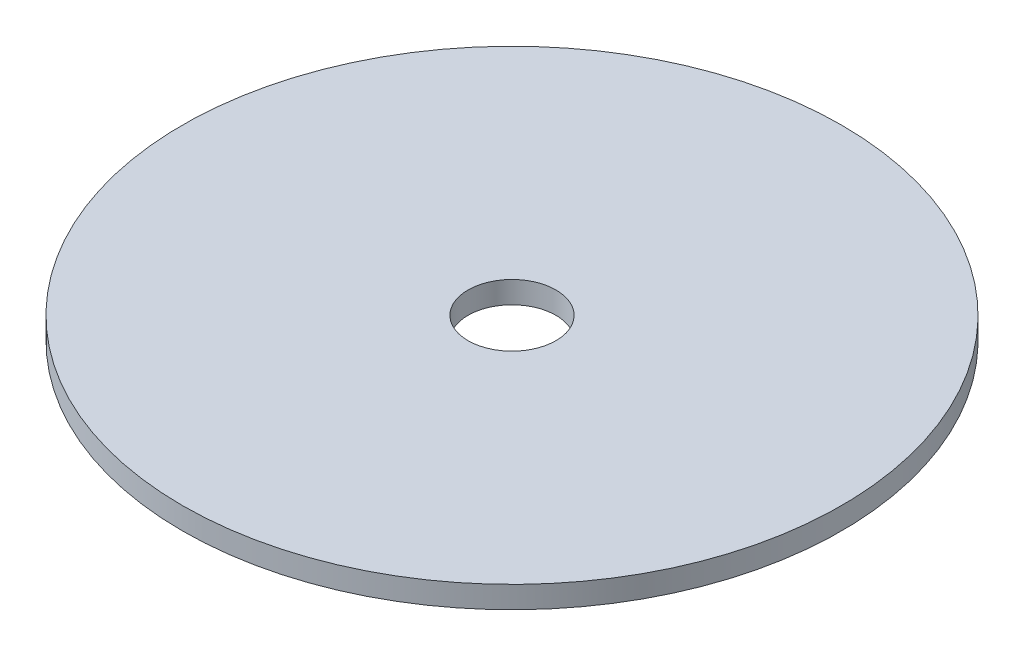
ISO-10303-21;
HEADER;
FILE_DESCRIPTION(('STEP AP214'),'2;1');
FILE_NAME('part.step','',(''),(''),'','','');
FILE_SCHEMA(('AUTOMOTIVE_DESIGN { 1 0 10303 214 1 1 1 1 }'));
ENDSEC;
DATA;
#1=APPLICATION_CONTEXT('core data for automotive mechanical design processes');
#2=APPLICATION_PROTOCOL_DEFINITION('international standard','automotive_design',2000,#1);
#3=PRODUCT_CONTEXT('',#1,'mechanical');
#4=PRODUCT('Part','Part','',(#3));
#5=PRODUCT_RELATED_PRODUCT_CATEGORY('part','',(#4));
#6=PRODUCT_DEFINITION_FORMATION('','',#4);
#7=PRODUCT_DEFINITION_CONTEXT('part definition',#1,'design');
#8=PRODUCT_DEFINITION('design','',#6,#7);
#9=PRODUCT_DEFINITION_SHAPE('','',#8);
#10=(LENGTH_UNIT() NAMED_UNIT(*) SI_UNIT(.MILLI.,.METRE.));
#11=(NAMED_UNIT(*) PLANE_ANGLE_UNIT() SI_UNIT($,.RADIAN.));
#12=(NAMED_UNIT(*) SI_UNIT($,.STERADIAN.) SOLID_ANGLE_UNIT());
#13=UNCERTAINTY_MEASURE_WITH_UNIT(LENGTH_MEASURE(1.E-05),#10,'distance_accuracy_value','');
#14=(GEOMETRIC_REPRESENTATION_CONTEXT(3) GLOBAL_UNCERTAINTY_ASSIGNED_CONTEXT((#13)) GLOBAL_UNIT_ASSIGNED_CONTEXT((#10,
#11,#12)) REPRESENTATION_CONTEXT('',''));
#15=CARTESIAN_POINT('',(0.,0.,0.));
#16=DIRECTION('',(0.,0.,1.));
#17=DIRECTION('',(1.,0.,0.));
#18=AXIS2_PLACEMENT_3D('',#15,#16,#17);
#19=CARTESIAN_POINT('',(0.,5.,0.));
#20=DIRECTION('',(0.,1.,0.));
#21=DIRECTION('',(0.,0.,1.));
#22=AXIS2_PLACEMENT_3D('',#19,#20,#21);
#23=PLANE('',#22);
#24=CARTESIAN_POINT('',(0.,5.,0.));
#25=DIRECTION('',(0.,1.,0.));
#26=DIRECTION('',(0.,0.,1.));
#27=AXIS2_PLACEMENT_3D('',#24,#25,#26);
#28=CIRCLE('',#27,75.);
#29=CARTESIAN_POINT('',(0.,5.,75.));
#30=VERTEX_POINT('',#29);
#31=EDGE_CURVE('E10',#30,#30,#28,.T.);
#32=ORIENTED_EDGE('',*,*,#31,.T.);
#33=EDGE_LOOP('',(#32));
#34=FACE_BOUND('',#33,.T.);
#35=CARTESIAN_POINT('',(0.,5.,0.));
#36=DIRECTION('',(0.,1.,0.));
#37=DIRECTION('',(0.,0.,1.));
#38=AXIS2_PLACEMENT_3D('',#35,#36,#37);
#39=CIRCLE('',#38,10.);
#40=CARTESIAN_POINT('',(0.,5.,10.));
#41=VERTEX_POINT('',#40);
#42=EDGE_CURVE('E42',#41,#41,#39,.T.);
#43=ORIENTED_EDGE('',*,*,#42,.F.);
#44=EDGE_LOOP('',(#43));
#45=FACE_BOUND('',#44,.T.);
#46=ADVANCED_FACE('F31',(#34,#45),#23,.T.);
#47=CARTESIAN_POINT('',(0.,0.,0.));
#48=DIRECTION('',(0.,1.,0.));
#49=DIRECTION('',(0.,0.,1.));
#50=AXIS2_PLACEMENT_3D('',#47,#48,#49);
#51=PLANE('',#50);
#52=CARTESIAN_POINT('',(0.,0.,0.));
#53=DIRECTION('',(0.,1.,0.));
#54=DIRECTION('',(0.,0.,1.));
#55=AXIS2_PLACEMENT_3D('',#52,#53,#54);
#56=CIRCLE('',#55,75.);
#57=CARTESIAN_POINT('',(0.,0.,75.));
#58=VERTEX_POINT('',#57);
#59=EDGE_CURVE('E35',#58,#58,#56,.T.);
#60=ORIENTED_EDGE('',*,*,#59,.F.);
#61=EDGE_LOOP('',(#60));
#62=FACE_BOUND('',#61,.T.);
#63=CARTESIAN_POINT('',(0.,0.,0.));
#64=DIRECTION('',(0.,1.,0.));
#65=DIRECTION('',(0.,0.,1.));
#66=AXIS2_PLACEMENT_3D('',#63,#64,#65);
#67=CIRCLE('',#66,10.);
#68=CARTESIAN_POINT('',(0.,0.,10.));
#69=VERTEX_POINT('',#68);
#70=EDGE_CURVE('E44',#69,#69,#67,.T.);
#71=ORIENTED_EDGE('',*,*,#70,.T.);
#72=EDGE_LOOP('',(#71));
#73=FACE_BOUND('',#72,.T.);
#74=ADVANCED_FACE('F54',(#62,#73),#51,.F.);
#75=CARTESIAN_POINT('',(0.,5.,0.));
#76=DIRECTION('',(0.,-1.,0.));
#77=DIRECTION('',(0.,0.,-1.));
#78=AXIS2_PLACEMENT_3D('',#75,#76,#77);
#79=CYLINDRICAL_SURFACE('',#78,75.);
#80=ORIENTED_EDGE('',*,*,#31,.F.);
#81=EDGE_LOOP('',(#80));
#82=FACE_BOUND('',#81,.T.);
#83=ORIENTED_EDGE('',*,*,#59,.T.);
#84=EDGE_LOOP('',(#83));
#85=FACE_BOUND('',#84,.T.);
#86=ADVANCED_FACE('F33',(#82,#85),#79,.T.);
#87=CARTESIAN_POINT('',(0.,5.,0.));
#88=DIRECTION('',(0.,-1.,0.));
#89=DIRECTION('',(0.,0.,-1.));
#90=AXIS2_PLACEMENT_3D('',#87,#88,#89);
#91=CYLINDRICAL_SURFACE('',#90,10.);
#92=ORIENTED_EDGE('',*,*,#42,.T.);
#93=EDGE_LOOP('',(#92));
#94=FACE_BOUND('',#93,.T.);
#95=ORIENTED_EDGE('',*,*,#70,.F.);
#96=EDGE_LOOP('',(#95));
#97=FACE_BOUND('',#96,.T.);
#98=ADVANCED_FACE('F50',(#94,#97),#91,.F.);
#99=CLOSED_SHELL('',(#46,#74,#86,#98));
#100=MANIFOLD_SOLID_BREP('B2',#99);
#101=ADVANCED_BREP_SHAPE_REPRESENTATION('',(#18,#100),#14);
#102=SHAPE_DEFINITION_REPRESENTATION(#9,#101);
ENDSEC;
END-ISO-10303-21;
